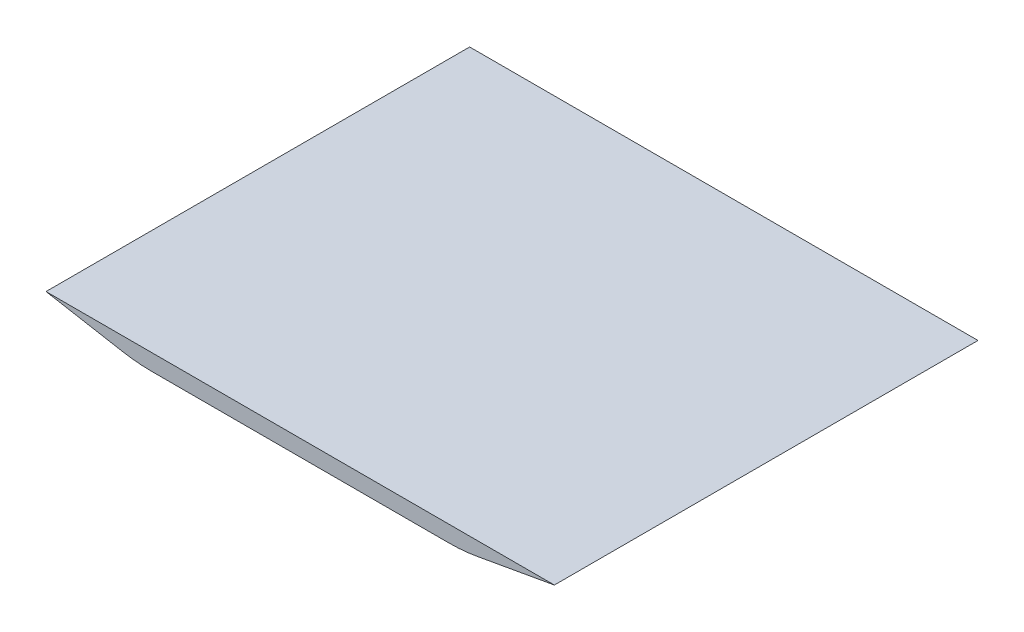
ISO-10303-21;
HEADER;
FILE_DESCRIPTION(('STEP AP214'),'2;1');
FILE_NAME('part.step','',(''),(''),'','','');
FILE_SCHEMA(('AUTOMOTIVE_DESIGN { 1 0 10303 214 1 1 1 1 }'));
ENDSEC;
DATA;
#1=APPLICATION_CONTEXT('core data for automotive mechanical design processes');
#2=APPLICATION_PROTOCOL_DEFINITION('international standard','automotive_design',2000,#1);
#3=PRODUCT_CONTEXT('',#1,'mechanical');
#4=PRODUCT('Part','Part','',(#3));
#5=PRODUCT_RELATED_PRODUCT_CATEGORY('part','',(#4));
#6=PRODUCT_DEFINITION_FORMATION('','',#4);
#7=PRODUCT_DEFINITION_CONTEXT('part definition',#1,'design');
#8=PRODUCT_DEFINITION('design','',#6,#7);
#9=PRODUCT_DEFINITION_SHAPE('','',#8);
#10=(LENGTH_UNIT() NAMED_UNIT(*) SI_UNIT(.MILLI.,.METRE.));
#11=(NAMED_UNIT(*) PLANE_ANGLE_UNIT() SI_UNIT($,.RADIAN.));
#12=(NAMED_UNIT(*) SI_UNIT($,.STERADIAN.) SOLID_ANGLE_UNIT());
#13=UNCERTAINTY_MEASURE_WITH_UNIT(LENGTH_MEASURE(1.E-05),#10,'distance_accuracy_value','');
#14=(GEOMETRIC_REPRESENTATION_CONTEXT(3) GLOBAL_UNCERTAINTY_ASSIGNED_CONTEXT((#13)) GLOBAL_UNIT_ASSIGNED_CONTEXT((#10,
#11,#12)) REPRESENTATION_CONTEXT('',''));
#15=CARTESIAN_POINT('',(0.,0.,0.));
#16=DIRECTION('',(0.,0.,1.));
#17=DIRECTION('',(1.,0.,0.));
#18=AXIS2_PLACEMENT_3D('',#15,#16,#17);
#19=CARTESIAN_POINT('',(28.,-5.00000000000001,130.));
#20=DIRECTION('',(0.175790638483658,0.984427575508482,0.));
#21=DIRECTION('',(-0.984427575508482,0.175790638483658,0.));
#22=AXIS2_PLACEMENT_3D('',#19,#20,#21);
#23=PLANE('',#22);
#24=DIRECTION('',(0.984427575508482,-0.175790638483658,0.));
#25=VECTOR('',#24,1.);
#26=CARTESIAN_POINT('',(28.,-5.00000000000001,0.));
#27=LINE('',#26,#25);
#28=CARTESIAN_POINT('',(0.,0.,0.));
#29=VERTEX_POINT('',#28);
#30=CARTESIAN_POINT('',(23.6397211423749,-4.22137877542411,0.));
#31=VERTEX_POINT('',#30);
#32=EDGE_CURVE('E117',#29,#31,#27,.T.);
#33=ORIENTED_EDGE('',*,*,#32,.T.);
#34=DIRECTION('',(0.,0.,-1.));
#35=VECTOR('',#34,1.);
#36=CARTESIAN_POINT('',(23.6397211423749,-4.22137877542411,130.));
#37=LINE('',#36,#35);
#38=CARTESIAN_POINT('',(23.6397211423749,-4.22137877542411,130.));
#39=VERTEX_POINT('',#38);
#40=EDGE_CURVE('E11',#31,#39,#37,.F.);
#41=ORIENTED_EDGE('',*,*,#40,.T.);
#42=DIRECTION('',(0.984427575508482,-0.175790638483658,0.));
#43=VECTOR('',#42,1.);
#44=CARTESIAN_POINT('',(28.,-5.00000000000001,130.));
#45=LINE('',#44,#43);
#46=CARTESIAN_POINT('',(0.,0.,130.));
#47=VERTEX_POINT('',#46);
#48=EDGE_CURVE('E123',#47,#39,#45,.T.);
#49=ORIENTED_EDGE('',*,*,#48,.F.);
#50=DIRECTION('',(0.,0.,-1.));
#51=VECTOR('',#50,1.);
#52=CARTESIAN_POINT('',(0.,0.,130.));
#53=LINE('',#52,#51);
#54=EDGE_CURVE('E109',#47,#29,#53,.T.);
#55=ORIENTED_EDGE('',*,*,#54,.T.);
#56=EDGE_LOOP('',(#33,#41,#49,#55));
#57=FACE_BOUND('',#56,.T.);
#58=ADVANCED_FACE('F35',(#57),#23,.F.);
#59=CARTESIAN_POINT('',(128.,-5.,130.));
#60=DIRECTION('',(0.,1.,0.));
#61=DIRECTION('',(-1.,0.,0.));
#62=AXIS2_PLACEMENT_3D('',#59,#60,#61);
#63=PLANE('',#62);
#64=DIRECTION('',(1.,0.,0.));
#65=VECTOR('',#64,1.);
#66=CARTESIAN_POINT('',(128.,-5.,0.));
#67=LINE('',#66,#65);
#68=CARTESIAN_POINT('',(32.4292530665578,-5.00000000000001,0.));
#69=VERTEX_POINT('',#68);
#70=CARTESIAN_POINT('',(123.570746933442,-5.,0.));
#71=VERTEX_POINT('',#70);
#72=EDGE_CURVE('E119',#69,#71,#67,.T.);
#73=ORIENTED_EDGE('',*,*,#72,.T.);
#74=DIRECTION('',(0.,0.,-1.));
#75=VECTOR('',#74,1.);
#76=CARTESIAN_POINT('',(123.570746933442,-5.,130.));
#77=LINE('',#76,#75);
#78=CARTESIAN_POINT('',(123.570746933442,-5.,130.));
#79=VERTEX_POINT('',#78);
#80=EDGE_CURVE('E56',#71,#79,#77,.F.);
#81=ORIENTED_EDGE('',*,*,#80,.T.);
#82=DIRECTION('',(1.,0.,0.));
#83=VECTOR('',#82,1.);
#84=CARTESIAN_POINT('',(128.,-5.,130.));
#85=LINE('',#84,#83);
#86=CARTESIAN_POINT('',(32.4292530665578,-5.00000000000001,130.));
#87=VERTEX_POINT('',#86);
#88=EDGE_CURVE('E99',#87,#79,#85,.T.);
#89=ORIENTED_EDGE('',*,*,#88,.F.);
#90=DIRECTION('',(0.,0.,-1.));
#91=VECTOR('',#90,1.);
#92=CARTESIAN_POINT('',(32.4292530665578,-5.00000000000001,130.));
#93=LINE('',#92,#91);
#94=EDGE_CURVE('E130',#87,#69,#93,.T.);
#95=ORIENTED_EDGE('',*,*,#94,.T.);
#96=EDGE_LOOP('',(#73,#81,#89,#95));
#97=FACE_BOUND('',#96,.T.);
#98=ADVANCED_FACE('F138',(#97),#63,.F.);
#99=CARTESIAN_POINT('',(156.,0.,130.));
#100=DIRECTION('',(-0.175790638483658,0.984427575508482,0.));
#101=DIRECTION('',(-0.984427575508482,-0.175790638483658,0.));
#102=AXIS2_PLACEMENT_3D('',#99,#100,#101);
#103=PLANE('',#102);
#104=DIRECTION('',(0.984427575508482,0.175790638483658,0.));
#105=VECTOR('',#104,1.);
#106=CARTESIAN_POINT('',(156.,0.,130.));
#107=LINE('',#106,#105);
#108=CARTESIAN_POINT('',(132.360278857625,-4.22137877542409,130.));
#109=VERTEX_POINT('',#108);
#110=CARTESIAN_POINT('',(156.,0.,130.));
#111=VERTEX_POINT('',#110);
#112=EDGE_CURVE('E89',#109,#111,#107,.T.);
#113=ORIENTED_EDGE('',*,*,#112,.F.);
#114=DIRECTION('',(0.,0.,-1.));
#115=VECTOR('',#114,1.);
#116=CARTESIAN_POINT('',(132.360278857625,-4.22137877542409,130.));
#117=LINE('',#116,#115);
#118=CARTESIAN_POINT('',(132.360278857625,-4.22137877542409,0.));
#119=VERTEX_POINT('',#118);
#120=EDGE_CURVE('E108',#109,#119,#117,.T.);
#121=ORIENTED_EDGE('',*,*,#120,.T.);
#122=DIRECTION('',(0.984427575508482,0.175790638483658,0.));
#123=VECTOR('',#122,1.);
#124=CARTESIAN_POINT('',(156.,0.,0.));
#125=LINE('',#124,#123);
#126=CARTESIAN_POINT('',(156.,0.,0.));
#127=VERTEX_POINT('',#126);
#128=EDGE_CURVE('E105',#119,#127,#125,.T.);
#129=ORIENTED_EDGE('',*,*,#128,.T.);
#130=DIRECTION('',(0.,0.,-1.));
#131=VECTOR('',#130,1.);
#132=CARTESIAN_POINT('',(156.,0.,130.));
#133=LINE('',#132,#131);
#134=EDGE_CURVE('E102',#111,#127,#133,.T.);
#135=ORIENTED_EDGE('',*,*,#134,.F.);
#136=EDGE_LOOP('',(#113,#121,#129,#135));
#137=FACE_BOUND('',#136,.T.);
#138=ADVANCED_FACE('F103',(#137),#103,.F.);
#139=CARTESIAN_POINT('',(0.,0.,130.));
#140=DIRECTION('',(0.,-1.,0.));
#141=DIRECTION('',(0.,0.,-1.));
#142=AXIS2_PLACEMENT_3D('',#139,#140,#141);
#143=PLANE('',#142);
#144=DIRECTION('',(-1.,0.,0.));
#145=VECTOR('',#144,1.);
#146=CARTESIAN_POINT('',(0.,0.,0.));
#147=LINE('',#146,#145);
#148=EDGE_CURVE('E122',#127,#29,#147,.T.);
#149=ORIENTED_EDGE('',*,*,#148,.T.);
#150=ORIENTED_EDGE('',*,*,#54,.F.);
#151=DIRECTION('',(-1.,0.,0.));
#152=VECTOR('',#151,1.);
#153=CARTESIAN_POINT('',(0.,0.,130.));
#154=LINE('',#153,#152);
#155=EDGE_CURVE('E93',#111,#47,#154,.T.);
#156=ORIENTED_EDGE('',*,*,#155,.F.);
#157=ORIENTED_EDGE('',*,*,#134,.T.);
#158=EDGE_LOOP('',(#149,#150,#156,#157));
#159=FACE_BOUND('',#158,.T.);
#160=ADVANCED_FACE('F111',(#159),#143,.F.);
#161=CARTESIAN_POINT('',(0.,0.,130.));
#162=DIRECTION('',(0.,0.,1.));
#163=DIRECTION('',(1.,0.,0.));
#164=AXIS2_PLACEMENT_3D('',#161,#162,#163);
#165=PLANE('',#164);
#166=ORIENTED_EDGE('',*,*,#88,.T.);
#167=CARTESIAN_POINT('',(123.570746933442,45.,130.));
#168=DIRECTION('',(0.,0.,1.));
#169=DIRECTION('',(1.,0.,0.));
#170=AXIS2_PLACEMENT_3D('',#167,#168,#169);
#171=CIRCLE('',#170,50.);
#172=EDGE_CURVE('E43',#79,#109,#171,.T.);
#173=ORIENTED_EDGE('',*,*,#172,.T.);
#174=ORIENTED_EDGE('',*,*,#112,.T.);
#175=ORIENTED_EDGE('',*,*,#155,.T.);
#176=ORIENTED_EDGE('',*,*,#48,.T.);
#177=CARTESIAN_POINT('',(32.4292530665578,45.,130.));
#178=DIRECTION('',(0.,0.,1.));
#179=DIRECTION('',(1.,0.,0.));
#180=AXIS2_PLACEMENT_3D('',#177,#178,#179);
#181=CIRCLE('',#180,50.);
#182=EDGE_CURVE('E134',#39,#87,#181,.T.);
#183=ORIENTED_EDGE('',*,*,#182,.T.);
#184=EDGE_LOOP('',(#166,#173,#174,#175,#176,#183));
#185=FACE_BOUND('',#184,.T.);
#186=ADVANCED_FACE('F91',(#185),#165,.T.);
#187=CARTESIAN_POINT('',(0.,0.,0.));
#188=DIRECTION('',(0.,0.,1.));
#189=DIRECTION('',(1.,0.,0.));
#190=AXIS2_PLACEMENT_3D('',#187,#188,#189);
#191=PLANE('',#190);
#192=ORIENTED_EDGE('',*,*,#128,.F.);
#193=CARTESIAN_POINT('',(123.570746933442,45.,0.));
#194=DIRECTION('',(0.,0.,1.));
#195=DIRECTION('',(1.,0.,0.));
#196=AXIS2_PLACEMENT_3D('',#193,#194,#195);
#197=CIRCLE('',#196,50.);
#198=EDGE_CURVE('E128',#119,#71,#197,.F.);
#199=ORIENTED_EDGE('',*,*,#198,.T.);
#200=ORIENTED_EDGE('',*,*,#72,.F.);
#201=CARTESIAN_POINT('',(32.4292530665578,45.,0.));
#202=DIRECTION('',(0.,0.,1.));
#203=DIRECTION('',(1.,0.,0.));
#204=AXIS2_PLACEMENT_3D('',#201,#202,#203);
#205=CIRCLE('',#204,50.);
#206=EDGE_CURVE('E126',#69,#31,#205,.F.);
#207=ORIENTED_EDGE('',*,*,#206,.T.);
#208=ORIENTED_EDGE('',*,*,#32,.F.);
#209=ORIENTED_EDGE('',*,*,#148,.F.);
#210=EDGE_LOOP('',(#192,#199,#200,#207,#208,#209));
#211=FACE_BOUND('',#210,.T.);
#212=ADVANCED_FACE('F142',(#211),#191,.F.);
#213=CARTESIAN_POINT('',(123.570746933442,45.,130.));
#214=DIRECTION('',(0.,0.,-1.));
#215=DIRECTION('',(-1.,0.,0.));
#216=AXIS2_PLACEMENT_3D('',#213,#214,#215);
#217=CYLINDRICAL_SURFACE('',#216,50.);
#218=ORIENTED_EDGE('',*,*,#172,.F.);
#219=ORIENTED_EDGE('',*,*,#80,.F.);
#220=ORIENTED_EDGE('',*,*,#198,.F.);
#221=ORIENTED_EDGE('',*,*,#120,.F.);
#222=EDGE_LOOP('',(#218,#219,#220,#221));
#223=FACE_BOUND('',#222,.T.);
#224=ADVANCED_FACE('F152',(#223),#217,.T.);
#225=CARTESIAN_POINT('',(32.4292530665578,45.,130.));
#226=DIRECTION('',(0.,0.,-1.));
#227=DIRECTION('',(-1.,0.,0.));
#228=AXIS2_PLACEMENT_3D('',#225,#226,#227);
#229=CYLINDRICAL_SURFACE('',#228,50.);
#230=ORIENTED_EDGE('',*,*,#182,.F.);
#231=ORIENTED_EDGE('',*,*,#40,.F.);
#232=ORIENTED_EDGE('',*,*,#206,.F.);
#233=ORIENTED_EDGE('',*,*,#94,.F.);
#234=EDGE_LOOP('',(#230,#231,#232,#233));
#235=FACE_BOUND('',#234,.T.);
#236=ADVANCED_FACE('F37',(#235),#229,.T.);
#237=CLOSED_SHELL('',(#58,#98,#138,#160,#186,#212,#224,#236));
#238=MANIFOLD_SOLID_BREP('B2',#237);
#239=ADVANCED_BREP_SHAPE_REPRESENTATION('',(#18,#238),#14);
#240=SHAPE_DEFINITION_REPRESENTATION(#9,#239);
ENDSEC;
END-ISO-10303-21;
